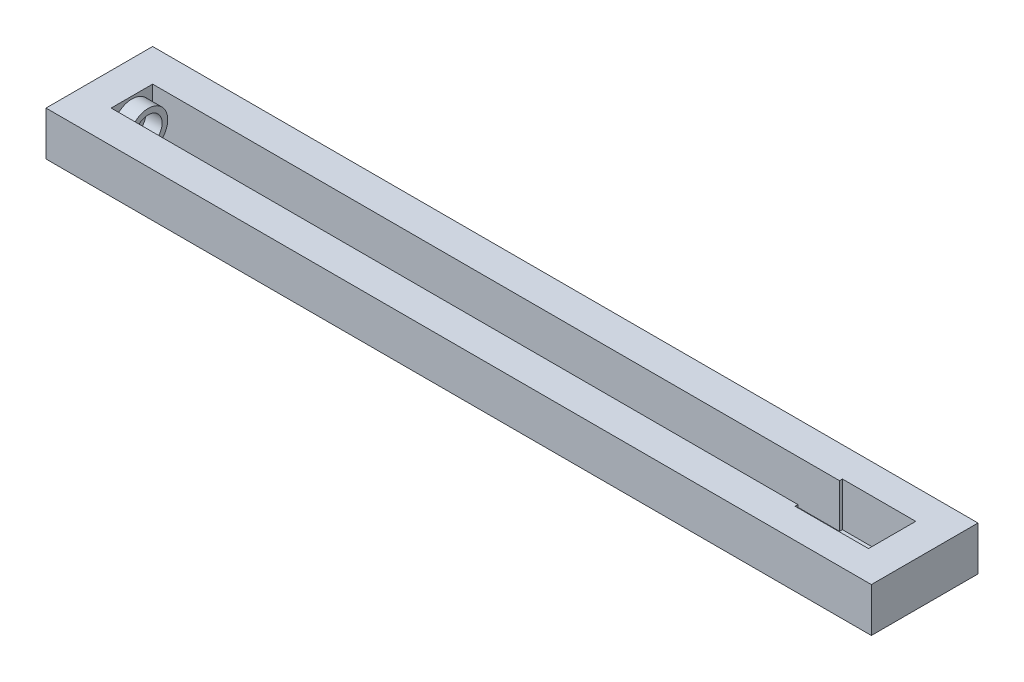
ISO-10303-21;
HEADER;
FILE_DESCRIPTION(('STEP AP214'),'2;1');
FILE_NAME('part.step','',(''),(''),'','','');
FILE_SCHEMA(('AUTOMOTIVE_DESIGN { 1 0 10303 214 1 1 1 1 }'));
ENDSEC;
DATA;
#1=APPLICATION_CONTEXT('core data for automotive mechanical design processes');
#2=APPLICATION_PROTOCOL_DEFINITION('international standard','automotive_design',2000,#1);
#3=PRODUCT_CONTEXT('',#1,'mechanical');
#4=PRODUCT('Part','Part','',(#3));
#5=PRODUCT_RELATED_PRODUCT_CATEGORY('part','',(#4));
#6=PRODUCT_DEFINITION_FORMATION('','',#4);
#7=PRODUCT_DEFINITION_CONTEXT('part definition',#1,'design');
#8=PRODUCT_DEFINITION('design','',#6,#7);
#9=PRODUCT_DEFINITION_SHAPE('','',#8);
#10=(LENGTH_UNIT() NAMED_UNIT(*) SI_UNIT(.MILLI.,.METRE.));
#11=(NAMED_UNIT(*) PLANE_ANGLE_UNIT() SI_UNIT($,.RADIAN.));
#12=(NAMED_UNIT(*) SI_UNIT($,.STERADIAN.) SOLID_ANGLE_UNIT());
#13=UNCERTAINTY_MEASURE_WITH_UNIT(LENGTH_MEASURE(1.E-05),#10,'distance_accuracy_value','');
#14=(GEOMETRIC_REPRESENTATION_CONTEXT(3) GLOBAL_UNCERTAINTY_ASSIGNED_CONTEXT((#13)) GLOBAL_UNIT_ASSIGNED_CONTEXT((#10,
#11,#12)) REPRESENTATION_CONTEXT('',''));
#15=CARTESIAN_POINT('',(0.,0.,0.));
#16=DIRECTION('',(0.,0.,1.));
#17=DIRECTION('',(1.,0.,0.));
#18=AXIS2_PLACEMENT_3D('',#15,#16,#17);
#19=CARTESIAN_POINT('',(0.,0.,0.));
#20=DIRECTION('',(0.,1.,0.));
#21=DIRECTION('',(0.,0.,1.));
#22=AXIS2_PLACEMENT_3D('',#19,#20,#21);
#23=PLANE('',#22);
#24=DIRECTION('',(0.,0.,1.));
#25=VECTOR('',#24,1.);
#26=CARTESIAN_POINT('',(-380.,0.,-49.1));
#27=LINE('',#26,#25);
#28=CARTESIAN_POINT('',(-380.,0.,-49.1));
#29=VERTEX_POINT('',#28);
#30=CARTESIAN_POINT('',(-380.,0.,49.1));
#31=VERTEX_POINT('',#30);
#32=EDGE_CURVE('E246',#29,#31,#27,.T.);
#33=ORIENTED_EDGE('',*,*,#32,.F.);
#34=DIRECTION('',(-1.,0.,0.));
#35=VECTOR('',#34,1.);
#36=CARTESIAN_POINT('',(-380.,0.,-49.1));
#37=LINE('',#36,#35);
#38=CARTESIAN_POINT('',(380.,0.,-49.1));
#39=VERTEX_POINT('',#38);
#40=EDGE_CURVE('E251',#39,#29,#37,.T.);
#41=ORIENTED_EDGE('',*,*,#40,.F.);
#42=DIRECTION('',(0.,0.,-1.));
#43=VECTOR('',#42,1.);
#44=CARTESIAN_POINT('',(380.,0.,-49.1));
#45=LINE('',#44,#43);
#46=CARTESIAN_POINT('',(380.,0.,49.1));
#47=VERTEX_POINT('',#46);
#48=EDGE_CURVE('E262',#47,#39,#45,.T.);
#49=ORIENTED_EDGE('',*,*,#48,.F.);
#50=DIRECTION('',(1.,0.,0.));
#51=VECTOR('',#50,1.);
#52=CARTESIAN_POINT('',(-380.,0.,49.1));
#53=LINE('',#52,#51);
#54=EDGE_CURVE('E260',#31,#47,#53,.T.);
#55=ORIENTED_EDGE('',*,*,#54,.F.);
#56=EDGE_LOOP('',(#33,#41,#49,#55));
#57=FACE_BOUND('',#56,.T.);
#58=DIRECTION('',(0.,0.,1.));
#59=VECTOR('',#58,1.);
#60=CARTESIAN_POINT('',(19.05,0.,-22.185));
#61=LINE('',#60,#59);
#62=CARTESIAN_POINT('',(19.05,0.,-22.185));
#63=VERTEX_POINT('',#62);
#64=CARTESIAN_POINT('',(19.05,0.,22.185));
#65=VERTEX_POINT('',#64);
#66=EDGE_CURVE('E171',#63,#65,#61,.T.);
#67=ORIENTED_EDGE('',*,*,#66,.F.);
#68=DIRECTION('',(1.,0.,0.));
#69=VECTOR('',#68,1.);
#70=CARTESIAN_POINT('',(-19.05,0.,-22.185));
#71=LINE('',#70,#69);
#72=CARTESIAN_POINT('',(-19.05,0.,-22.185));
#73=VERTEX_POINT('',#72);
#74=EDGE_CURVE('E168',#73,#63,#71,.T.);
#75=ORIENTED_EDGE('',*,*,#74,.F.);
#76=DIRECTION('',(0.,0.,-1.));
#77=VECTOR('',#76,1.);
#78=CARTESIAN_POINT('',(-19.05,0.,-22.185));
#79=LINE('',#78,#77);
#80=CARTESIAN_POINT('',(-19.05,0.,22.185));
#81=VERTEX_POINT('',#80);
#82=EDGE_CURVE('E58',#81,#73,#79,.T.);
#83=ORIENTED_EDGE('',*,*,#82,.F.);
#84=DIRECTION('',(-1.,0.,0.));
#85=VECTOR('',#84,1.);
#86=CARTESIAN_POINT('',(-19.05,0.,22.185));
#87=LINE('',#86,#85);
#88=EDGE_CURVE('E53',#65,#81,#87,.T.);
#89=ORIENTED_EDGE('',*,*,#88,.F.);
#90=EDGE_LOOP('',(#67,#75,#83,#89));
#91=FACE_BOUND('',#90,.T.);
#92=ADVANCED_FACE('F38',(#57,#91),#23,.F.);
#93=CARTESIAN_POINT('',(350.,40.64,-19.1));
#94=DIRECTION('',(-1.,0.,0.));
#95=DIRECTION('',(0.,0.,1.));
#96=AXIS2_PLACEMENT_3D('',#93,#94,#95);
#97=PLANE('',#96);
#98=DIRECTION('',(0.,0.,-1.));
#99=VECTOR('',#98,1.);
#100=CARTESIAN_POINT('',(350.,40.64,-19.1));
#101=LINE('',#100,#99);
#102=CARTESIAN_POINT('',(350.,40.64,21.75));
#103=VERTEX_POINT('',#102);
#104=CARTESIAN_POINT('',(350.,40.64,-21.75));
#105=VERTEX_POINT('',#104);
#106=EDGE_CURVE('E230',#103,#105,#101,.T.);
#107=ORIENTED_EDGE('',*,*,#106,.T.);
#108=DIRECTION('',(0.,1.,0.));
#109=VECTOR('',#108,1.);
#110=CARTESIAN_POINT('',(350.,-80.0485528859451,-21.75));
#111=LINE('',#110,#109);
#112=CARTESIAN_POINT('',(350.,0.254000000000004,-21.75));
#113=VERTEX_POINT('',#112);
#114=EDGE_CURVE('E210',#113,#105,#111,.T.);
#115=ORIENTED_EDGE('',*,*,#114,.F.);
#116=DIRECTION('',(0.,0.,1.));
#117=VECTOR('',#116,1.);
#118=CARTESIAN_POINT('',(350.,0.254,19.1));
#119=LINE('',#118,#117);
#120=CARTESIAN_POINT('',(350.,0.254000000000004,21.75));
#121=VERTEX_POINT('',#120);
#122=EDGE_CURVE('E220',#113,#121,#119,.T.);
#123=ORIENTED_EDGE('',*,*,#122,.T.);
#124=DIRECTION('',(0.,1.,0.));
#125=VECTOR('',#124,1.);
#126=CARTESIAN_POINT('',(350.,-80.0485528859451,21.75));
#127=LINE('',#126,#125);
#128=EDGE_CURVE('E202',#121,#103,#127,.T.);
#129=ORIENTED_EDGE('',*,*,#128,.T.);
#130=EDGE_LOOP('',(#107,#115,#123,#129));
#131=FACE_BOUND('',#130,.T.);
#132=ADVANCED_FACE('F308',(#131),#97,.T.);
#133=CARTESIAN_POINT('',(-350.,40.64,-19.1));
#134=DIRECTION('',(0.,0.,1.));
#135=DIRECTION('',(1.,0.,0.));
#136=AXIS2_PLACEMENT_3D('',#133,#134,#135);
#137=PLANE('',#136);
#138=DIRECTION('',(0.,-1.,0.));
#139=VECTOR('',#138,1.);
#140=CARTESIAN_POINT('',(282.5,40.64,-19.1));
#141=LINE('',#140,#139);
#142=CARTESIAN_POINT('',(282.5,40.64,-19.1));
#143=VERTEX_POINT('',#142);
#144=CARTESIAN_POINT('',(282.5,0.254000000000004,-19.1));
#145=VERTEX_POINT('',#144);
#146=EDGE_CURVE('E218',#143,#145,#141,.T.);
#147=ORIENTED_EDGE('',*,*,#146,.F.);
#148=DIRECTION('',(-1.,0.,0.));
#149=VECTOR('',#148,1.);
#150=CARTESIAN_POINT('',(-350.,40.64,-19.1));
#151=LINE('',#150,#149);
#152=CARTESIAN_POINT('',(-350.,40.64,-19.1));
#153=VERTEX_POINT('',#152);
#154=EDGE_CURVE('E232',#143,#153,#151,.T.);
#155=ORIENTED_EDGE('',*,*,#154,.T.);
#156=DIRECTION('',(0.,-1.,0.));
#157=VECTOR('',#156,1.);
#158=CARTESIAN_POINT('',(-350.,40.64,-19.1));
#159=LINE('',#158,#157);
#160=CARTESIAN_POINT('',(-349.999999999999,0.254,-19.1));
#161=VERTEX_POINT('',#160);
#162=EDGE_CURVE('E243',#153,#161,#159,.T.);
#163=ORIENTED_EDGE('',*,*,#162,.T.);
#164=DIRECTION('',(1.,0.,0.));
#165=VECTOR('',#164,1.);
#166=CARTESIAN_POINT('',(-349.999999999999,0.254,-19.1));
#167=LINE('',#166,#165);
#168=EDGE_CURVE('E227',#161,#145,#167,.T.);
#169=ORIENTED_EDGE('',*,*,#168,.T.);
#170=EDGE_LOOP('',(#147,#155,#163,#169));
#171=FACE_BOUND('',#170,.T.);
#172=ADVANCED_FACE('F312',(#171),#137,.T.);
#173=CARTESIAN_POINT('',(-350.,40.64,-19.1));
#174=DIRECTION('',(1.,0.,0.));
#175=DIRECTION('',(0.,0.,-1.));
#176=AXIS2_PLACEMENT_3D('',#173,#174,#175);
#177=PLANE('',#176);
#178=CARTESIAN_POINT('',(-350.,20.32,0.));
#179=DIRECTION('',(1.,0.,0.));
#180=DIRECTION('',(0.,0.,-1.));
#181=AXIS2_PLACEMENT_3D('',#178,#179,#180);
#182=CIRCLE('',#181,18.);
#183=CARTESIAN_POINT('',(-350.,20.32,-18.));
#184=VERTEX_POINT('',#183);
#185=EDGE_CURVE('E175',#184,#184,#182,.T.);
#186=ORIENTED_EDGE('',*,*,#185,.F.);
#187=EDGE_LOOP('',(#186));
#188=FACE_BOUND('',#187,.T.);
#189=DIRECTION('',(0.,-1.,0.));
#190=VECTOR('',#189,1.);
#191=CARTESIAN_POINT('',(-350.,40.64,19.1));
#192=LINE('',#191,#190);
#193=CARTESIAN_POINT('',(-350.,40.64,19.1));
#194=VERTEX_POINT('',#193);
#195=CARTESIAN_POINT('',(-350.,0.253999999999997,19.1));
#196=VERTEX_POINT('',#195);
#197=EDGE_CURVE('E240',#194,#196,#192,.T.);
#198=ORIENTED_EDGE('',*,*,#197,.T.);
#199=DIRECTION('',(0.,0.,-1.));
#200=VECTOR('',#199,1.);
#201=CARTESIAN_POINT('',(-349.999999999999,0.254,19.1));
#202=LINE('',#201,#200);
#203=EDGE_CURVE('E224',#196,#161,#202,.T.);
#204=ORIENTED_EDGE('',*,*,#203,.T.);
#205=ORIENTED_EDGE('',*,*,#162,.F.);
#206=DIRECTION('',(0.,0.,1.));
#207=VECTOR('',#206,1.);
#208=CARTESIAN_POINT('',(-350.,40.64,-19.1));
#209=LINE('',#208,#207);
#210=EDGE_CURVE('E234',#153,#194,#209,.T.);
#211=ORIENTED_EDGE('',*,*,#210,.T.);
#212=EDGE_LOOP('',(#198,#204,#205,#211));
#213=FACE_BOUND('',#212,.T.);
#214=ADVANCED_FACE('F301',(#188,#213),#177,.T.);
#215=CARTESIAN_POINT('',(-350.,40.64,19.1));
#216=DIRECTION('',(0.,0.,-1.));
#217=DIRECTION('',(-1.,0.,0.));
#218=AXIS2_PLACEMENT_3D('',#215,#216,#217);
#219=PLANE('',#218);
#220=DIRECTION('',(0.,1.,0.));
#221=VECTOR('',#220,1.);
#222=CARTESIAN_POINT('',(282.5,40.64,19.1));
#223=LINE('',#222,#221);
#224=CARTESIAN_POINT('',(282.5,0.254000000000004,19.1));
#225=VERTEX_POINT('',#224);
#226=CARTESIAN_POINT('',(282.5,40.64,19.1));
#227=VERTEX_POINT('',#226);
#228=EDGE_CURVE('E216',#225,#227,#223,.T.);
#229=ORIENTED_EDGE('',*,*,#228,.F.);
#230=DIRECTION('',(-1.,0.,0.));
#231=VECTOR('',#230,1.);
#232=CARTESIAN_POINT('',(-349.999999999999,0.254,19.1));
#233=LINE('',#232,#231);
#234=EDGE_CURVE('E222',#225,#196,#233,.T.);
#235=ORIENTED_EDGE('',*,*,#234,.T.);
#236=ORIENTED_EDGE('',*,*,#197,.F.);
#237=DIRECTION('',(1.,0.,0.));
#238=VECTOR('',#237,1.);
#239=CARTESIAN_POINT('',(-350.,40.64,19.1));
#240=LINE('',#239,#238);
#241=EDGE_CURVE('E237',#194,#227,#240,.T.);
#242=ORIENTED_EDGE('',*,*,#241,.T.);
#243=EDGE_LOOP('',(#229,#235,#236,#242));
#244=FACE_BOUND('',#243,.T.);
#245=ADVANCED_FACE('F294',(#244),#219,.T.);
#246=CARTESIAN_POINT('',(0.,40.64,0.));
#247=DIRECTION('',(0.,1.,0.));
#248=DIRECTION('',(0.,0.,1.));
#249=AXIS2_PLACEMENT_3D('',#246,#247,#248);
#250=PLANE('',#249);
#251=DIRECTION('',(0.,0.,1.));
#252=VECTOR('',#251,1.);
#253=CARTESIAN_POINT('',(282.5,40.64,-21.75));
#254=LINE('',#253,#252);
#255=CARTESIAN_POINT('',(282.5,40.64,21.75));
#256=VERTEX_POINT('',#255);
#257=EDGE_CURVE('E193',#227,#256,#254,.T.);
#258=ORIENTED_EDGE('',*,*,#257,.F.);
#259=ORIENTED_EDGE('',*,*,#241,.F.);
#260=ORIENTED_EDGE('',*,*,#210,.F.);
#261=ORIENTED_EDGE('',*,*,#154,.F.);
#262=CARTESIAN_POINT('',(282.5,40.64,-21.75));
#263=VERTEX_POINT('',#262);
#264=EDGE_CURVE('E191',#263,#143,#254,.T.);
#265=ORIENTED_EDGE('',*,*,#264,.F.);
#266=DIRECTION('',(-1.,0.,0.));
#267=VECTOR('',#266,1.);
#268=CARTESIAN_POINT('',(350.,40.64,-21.75));
#269=LINE('',#268,#267);
#270=EDGE_CURVE('E184',#105,#263,#269,.T.);
#271=ORIENTED_EDGE('',*,*,#270,.F.);
#272=ORIENTED_EDGE('',*,*,#106,.F.);
#273=DIRECTION('',(1.,0.,0.));
#274=VECTOR('',#273,1.);
#275=CARTESIAN_POINT('',(350.,40.64,21.75));
#276=LINE('',#275,#274);
#277=EDGE_CURVE('E187',#256,#103,#276,.T.);
#278=ORIENTED_EDGE('',*,*,#277,.F.);
#279=EDGE_LOOP('',(#258,#259,#260,#261,#265,#271,#272,#278));
#280=FACE_BOUND('',#279,.T.);
#281=DIRECTION('',(0.,0.,1.));
#282=VECTOR('',#281,1.);
#283=CARTESIAN_POINT('',(-380.,40.64,-49.1));
#284=LINE('',#283,#282);
#285=CARTESIAN_POINT('',(-380.,40.64,-49.1));
#286=VERTEX_POINT('',#285);
#287=CARTESIAN_POINT('',(-380.,40.64,49.1));
#288=VERTEX_POINT('',#287);
#289=EDGE_CURVE('E247',#286,#288,#284,.T.);
#290=ORIENTED_EDGE('',*,*,#289,.T.);
#291=DIRECTION('',(1.,0.,0.));
#292=VECTOR('',#291,1.);
#293=CARTESIAN_POINT('',(-380.,40.64,49.1));
#294=LINE('',#293,#292);
#295=CARTESIAN_POINT('',(380.,40.64,49.1));
#296=VERTEX_POINT('',#295);
#297=EDGE_CURVE('E250',#288,#296,#294,.T.);
#298=ORIENTED_EDGE('',*,*,#297,.T.);
#299=DIRECTION('',(0.,0.,-1.));
#300=VECTOR('',#299,1.);
#301=CARTESIAN_POINT('',(380.,40.64,-49.1));
#302=LINE('',#301,#300);
#303=CARTESIAN_POINT('',(380.,40.64,-49.1));
#304=VERTEX_POINT('',#303);
#305=EDGE_CURVE('E253',#296,#304,#302,.T.);
#306=ORIENTED_EDGE('',*,*,#305,.T.);
#307=DIRECTION('',(-1.,0.,0.));
#308=VECTOR('',#307,1.);
#309=CARTESIAN_POINT('',(-380.,40.64,-49.1));
#310=LINE('',#309,#308);
#311=EDGE_CURVE('E255',#304,#286,#310,.T.);
#312=ORIENTED_EDGE('',*,*,#311,.T.);
#313=EDGE_LOOP('',(#290,#298,#306,#312));
#314=FACE_BOUND('',#313,.T.);
#315=ADVANCED_FACE('F292',(#280,#314),#250,.T.);
#316=CARTESIAN_POINT('',(-380.,40.64,-49.1));
#317=DIRECTION('',(1.,0.,0.));
#318=DIRECTION('',(0.,0.,-1.));
#319=AXIS2_PLACEMENT_3D('',#316,#317,#318);
#320=PLANE('',#319);
#321=ORIENTED_EDGE('',*,*,#32,.T.);
#322=DIRECTION('',(0.,-1.,0.));
#323=VECTOR('',#322,1.);
#324=CARTESIAN_POINT('',(-380.,40.64,49.1));
#325=LINE('',#324,#323);
#326=EDGE_CURVE('E46',#288,#31,#325,.T.);
#327=ORIENTED_EDGE('',*,*,#326,.F.);
#328=ORIENTED_EDGE('',*,*,#289,.F.);
#329=DIRECTION('',(0.,-1.,0.));
#330=VECTOR('',#329,1.);
#331=CARTESIAN_POINT('',(-380.,40.64,-49.1));
#332=LINE('',#331,#330);
#333=EDGE_CURVE('E257',#286,#29,#332,.T.);
#334=ORIENTED_EDGE('',*,*,#333,.T.);
#335=EDGE_LOOP('',(#321,#327,#328,#334));
#336=FACE_BOUND('',#335,.T.);
#337=ADVANCED_FACE('F40',(#336),#320,.F.);
#338=CARTESIAN_POINT('',(-380.,40.64,49.1));
#339=DIRECTION('',(0.,0.,-1.));
#340=DIRECTION('',(-1.,0.,0.));
#341=AXIS2_PLACEMENT_3D('',#338,#339,#340);
#342=PLANE('',#341);
#343=ORIENTED_EDGE('',*,*,#54,.T.);
#344=DIRECTION('',(0.,-1.,0.));
#345=VECTOR('',#344,1.);
#346=CARTESIAN_POINT('',(380.,40.64,49.1));
#347=LINE('',#346,#345);
#348=EDGE_CURVE('E270',#296,#47,#347,.T.);
#349=ORIENTED_EDGE('',*,*,#348,.F.);
#350=ORIENTED_EDGE('',*,*,#297,.F.);
#351=ORIENTED_EDGE('',*,*,#326,.T.);
#352=EDGE_LOOP('',(#343,#349,#350,#351));
#353=FACE_BOUND('',#352,.T.);
#354=ADVANCED_FACE('F275',(#353),#342,.F.);
#355=CARTESIAN_POINT('',(380.,40.64,-49.1));
#356=DIRECTION('',(-1.,0.,0.));
#357=DIRECTION('',(0.,0.,1.));
#358=AXIS2_PLACEMENT_3D('',#355,#356,#357);
#359=PLANE('',#358);
#360=ORIENTED_EDGE('',*,*,#48,.T.);
#361=DIRECTION('',(0.,-1.,0.));
#362=VECTOR('',#361,1.);
#363=CARTESIAN_POINT('',(380.,40.64,-49.1));
#364=LINE('',#363,#362);
#365=EDGE_CURVE('E267',#304,#39,#364,.T.);
#366=ORIENTED_EDGE('',*,*,#365,.F.);
#367=ORIENTED_EDGE('',*,*,#305,.F.);
#368=ORIENTED_EDGE('',*,*,#348,.T.);
#369=EDGE_LOOP('',(#360,#366,#367,#368));
#370=FACE_BOUND('',#369,.T.);
#371=ADVANCED_FACE('F286',(#370),#359,.F.);
#372=CARTESIAN_POINT('',(-380.,40.64,-49.1));
#373=DIRECTION('',(0.,0.,1.));
#374=DIRECTION('',(1.,0.,0.));
#375=AXIS2_PLACEMENT_3D('',#372,#373,#374);
#376=PLANE('',#375);
#377=ORIENTED_EDGE('',*,*,#40,.T.);
#378=ORIENTED_EDGE('',*,*,#333,.F.);
#379=ORIENTED_EDGE('',*,*,#311,.F.);
#380=ORIENTED_EDGE('',*,*,#365,.T.);
#381=EDGE_LOOP('',(#377,#378,#379,#380));
#382=FACE_BOUND('',#381,.T.);
#383=ADVANCED_FACE('F290',(#382),#376,.F.);
#384=CARTESIAN_POINT('',(0.,0.254,0.));
#385=DIRECTION('',(0.,-1.,0.));
#386=DIRECTION('',(0.,0.,-1.));
#387=AXIS2_PLACEMENT_3D('',#384,#385,#386);
#388=PLANE('',#387);
#389=ORIENTED_EDGE('',*,*,#234,.F.);
#390=DIRECTION('',(0.,0.,1.));
#391=VECTOR('',#390,1.);
#392=CARTESIAN_POINT('',(282.5,0.254000000000004,-21.75));
#393=LINE('',#392,#391);
#394=CARTESIAN_POINT('',(282.5,0.254000000000004,21.75));
#395=VERTEX_POINT('',#394);
#396=EDGE_CURVE('E207',#225,#395,#393,.T.);
#397=ORIENTED_EDGE('',*,*,#396,.T.);
#398=DIRECTION('',(1.,0.,0.));
#399=VECTOR('',#398,1.);
#400=CARTESIAN_POINT('',(350.,0.254000000000004,21.75));
#401=LINE('',#400,#399);
#402=EDGE_CURVE('E199',#395,#121,#401,.T.);
#403=ORIENTED_EDGE('',*,*,#402,.T.);
#404=ORIENTED_EDGE('',*,*,#122,.F.);
#405=DIRECTION('',(-1.,0.,0.));
#406=VECTOR('',#405,1.);
#407=CARTESIAN_POINT('',(350.,0.254000000000004,-21.75));
#408=LINE('',#407,#406);
#409=CARTESIAN_POINT('',(282.5,0.254000000000004,-21.75));
#410=VERTEX_POINT('',#409);
#411=EDGE_CURVE('E190',#113,#410,#408,.T.);
#412=ORIENTED_EDGE('',*,*,#411,.T.);
#413=EDGE_CURVE('E204',#410,#145,#393,.T.);
#414=ORIENTED_EDGE('',*,*,#413,.T.);
#415=ORIENTED_EDGE('',*,*,#168,.F.);
#416=ORIENTED_EDGE('',*,*,#203,.F.);
#417=EDGE_LOOP('',(#389,#397,#403,#404,#412,#414,#415,#416));
#418=FACE_BOUND('',#417,.T.);
#419=ADVANCED_FACE('F317',(#418),#388,.F.);
#420=CARTESIAN_POINT('',(282.5,-80.0485528859451,-21.75));
#421=DIRECTION('',(-1.,0.,0.));
#422=DIRECTION('',(0.,0.,1.));
#423=AXIS2_PLACEMENT_3D('',#420,#421,#422);
#424=PLANE('',#423);
#425=ORIENTED_EDGE('',*,*,#146,.T.);
#426=ORIENTED_EDGE('',*,*,#413,.F.);
#427=DIRECTION('',(0.,1.,0.));
#428=VECTOR('',#427,1.);
#429=CARTESIAN_POINT('',(282.5,-80.0485528859451,-21.75));
#430=LINE('',#429,#428);
#431=EDGE_CURVE('E198',#410,#263,#430,.T.);
#432=ORIENTED_EDGE('',*,*,#431,.T.);
#433=ORIENTED_EDGE('',*,*,#264,.T.);
#434=EDGE_LOOP('',(#425,#426,#432,#433));
#435=FACE_BOUND('',#434,.T.);
#436=ADVANCED_FACE('F339',(#435),#424,.F.);
#437=CARTESIAN_POINT('',(350.,-80.0485528859451,-21.75));
#438=DIRECTION('',(0.,0.,-1.));
#439=DIRECTION('',(-1.,0.,0.));
#440=AXIS2_PLACEMENT_3D('',#437,#438,#439);
#441=PLANE('',#440);
#442=ORIENTED_EDGE('',*,*,#114,.T.);
#443=ORIENTED_EDGE('',*,*,#270,.T.);
#444=ORIENTED_EDGE('',*,*,#431,.F.);
#445=ORIENTED_EDGE('',*,*,#411,.F.);
#446=EDGE_LOOP('',(#442,#443,#444,#445));
#447=FACE_BOUND('',#446,.T.);
#448=ADVANCED_FACE('F347',(#447),#441,.F.);
#449=ORIENTED_EDGE('',*,*,#228,.T.);
#450=ORIENTED_EDGE('',*,*,#257,.T.);
#451=DIRECTION('',(0.,1.,0.));
#452=VECTOR('',#451,1.);
#453=CARTESIAN_POINT('',(282.5,-80.0485528859451,21.75));
#454=LINE('',#453,#452);
#455=EDGE_CURVE('E203',#395,#256,#454,.T.);
#456=ORIENTED_EDGE('',*,*,#455,.F.);
#457=ORIENTED_EDGE('',*,*,#396,.F.);
#458=EDGE_LOOP('',(#449,#450,#456,#457));
#459=FACE_BOUND('',#458,.T.);
#460=ADVANCED_FACE('F350',(#459),#424,.F.);
#461=CARTESIAN_POINT('',(350.,-80.0485528859451,21.75));
#462=DIRECTION('',(0.,0.,1.));
#463=DIRECTION('',(1.,0.,0.));
#464=AXIS2_PLACEMENT_3D('',#461,#462,#463);
#465=PLANE('',#464);
#466=ORIENTED_EDGE('',*,*,#455,.T.);
#467=ORIENTED_EDGE('',*,*,#277,.T.);
#468=ORIENTED_EDGE('',*,*,#128,.F.);
#469=ORIENTED_EDGE('',*,*,#402,.F.);
#470=EDGE_LOOP('',(#466,#467,#468,#469));
#471=FACE_BOUND('',#470,.T.);
#472=ADVANCED_FACE('F363',(#471),#465,.F.);
#473=CARTESIAN_POINT('',(-335.,20.32,0.));
#474=DIRECTION('',(1.,0.,0.));
#475=DIRECTION('',(0.,0.,-1.));
#476=AXIS2_PLACEMENT_3D('',#473,#474,#475);
#477=PLANE('',#476);
#478=CARTESIAN_POINT('',(-335.,20.32,0.));
#479=DIRECTION('',(1.,0.,0.));
#480=DIRECTION('',(0.,0.,-1.));
#481=AXIS2_PLACEMENT_3D('',#478,#479,#480);
#482=CIRCLE('',#481,18.);
#483=CARTESIAN_POINT('',(-335.,20.32,-18.));
#484=VERTEX_POINT('',#483);
#485=EDGE_CURVE('E181',#484,#484,#482,.T.);
#486=ORIENTED_EDGE('',*,*,#485,.T.);
#487=EDGE_LOOP('',(#486));
#488=FACE_BOUND('',#487,.T.);
#489=CARTESIAN_POINT('',(-335.,20.32,0.));
#490=DIRECTION('',(1.,0.,0.));
#491=DIRECTION('',(0.,0.,-1.));
#492=AXIS2_PLACEMENT_3D('',#489,#490,#491);
#493=CIRCLE('',#492,12.8397);
#494=CARTESIAN_POINT('',(-335.,20.32,-12.8397));
#495=VERTEX_POINT('',#494);
#496=EDGE_CURVE('E172',#495,#495,#493,.T.);
#497=ORIENTED_EDGE('',*,*,#496,.F.);
#498=EDGE_LOOP('',(#497));
#499=FACE_BOUND('',#498,.T.);
#500=ADVANCED_FACE('F370',(#488,#499),#477,.T.);
#501=CARTESIAN_POINT('',(-335.,20.32,0.));
#502=DIRECTION('',(-1.,0.,0.));
#503=DIRECTION('',(0.,0.,1.));
#504=AXIS2_PLACEMENT_3D('',#501,#502,#503);
#505=CYLINDRICAL_SURFACE('',#504,18.);
#506=ORIENTED_EDGE('',*,*,#485,.F.);
#507=EDGE_LOOP('',(#506));
#508=FACE_BOUND('',#507,.T.);
#509=ORIENTED_EDGE('',*,*,#185,.T.);
#510=EDGE_LOOP('',(#509));
#511=FACE_BOUND('',#510,.T.);
#512=ADVANCED_FACE('F379',(#508,#511),#505,.T.);
#513=CARTESIAN_POINT('',(-335.,20.32,0.));
#514=DIRECTION('',(-1.,0.,0.));
#515=DIRECTION('',(0.,0.,1.));
#516=AXIS2_PLACEMENT_3D('',#513,#514,#515);
#517=CYLINDRICAL_SURFACE('',#516,12.8397);
#518=ORIENTED_EDGE('',*,*,#496,.T.);
#519=EDGE_LOOP('',(#518));
#520=FACE_BOUND('',#519,.T.);
#521=CARTESIAN_POINT('',(-350.,20.32,0.));
#522=DIRECTION('',(1.,0.,0.));
#523=DIRECTION('',(0.,0.,-1.));
#524=AXIS2_PLACEMENT_3D('',#521,#522,#523);
#525=CIRCLE('',#524,12.8397);
#526=CARTESIAN_POINT('',(-350.,20.32,-12.8397));
#527=VERTEX_POINT('',#526);
#528=EDGE_CURVE('E11',#527,#527,#525,.F.);
#529=ORIENTED_EDGE('',*,*,#528,.T.);
#530=EDGE_LOOP('',(#529));
#531=FACE_BOUND('',#530,.T.);
#532=ADVANCED_FACE('F387',(#520,#531),#517,.F.);
#533=ORIENTED_EDGE('',*,*,#528,.F.);
#534=EDGE_LOOP('',(#533));
#535=FACE_BOUND('',#534,.T.);
#536=ADVANCED_FACE('F395',(#535),#177,.T.);
#537=CARTESIAN_POINT('',(19.05,-20.,-22.185));
#538=DIRECTION('',(-1.,0.,0.));
#539=DIRECTION('',(0.,0.,1.));
#540=AXIS2_PLACEMENT_3D('',#537,#538,#539);
#541=PLANE('',#540);
#542=ORIENTED_EDGE('',*,*,#66,.T.);
#543=DIRECTION('',(0.,1.,0.));
#544=VECTOR('',#543,1.);
#545=CARTESIAN_POINT('',(19.05,-20.,22.185));
#546=LINE('',#545,#544);
#547=CARTESIAN_POINT('',(19.05,-20.,22.185));
#548=VERTEX_POINT('',#547);
#549=EDGE_CURVE('E152',#548,#65,#546,.T.);
#550=ORIENTED_EDGE('',*,*,#549,.F.);
#551=DIRECTION('',(0.,0.,1.));
#552=VECTOR('',#551,1.);
#553=CARTESIAN_POINT('',(19.05,-20.,-22.185));
#554=LINE('',#553,#552);
#555=CARTESIAN_POINT('',(19.05,-20.,-22.185));
#556=VERTEX_POINT('',#555);
#557=EDGE_CURVE('E159',#556,#548,#554,.T.);
#558=ORIENTED_EDGE('',*,*,#557,.F.);
#559=DIRECTION('',(0.,1.,0.));
#560=VECTOR('',#559,1.);
#561=CARTESIAN_POINT('',(19.05,-20.,-22.185));
#562=LINE('',#561,#560);
#563=EDGE_CURVE('E544',#556,#63,#562,.T.);
#564=ORIENTED_EDGE('',*,*,#563,.T.);
#565=EDGE_LOOP('',(#542,#550,#558,#564));
#566=FACE_BOUND('',#565,.T.);
#567=ADVANCED_FACE('F170',(#566),#541,.F.);
#568=CARTESIAN_POINT('',(-19.05,-20.,22.185));
#569=DIRECTION('',(0.,0.,-1.));
#570=DIRECTION('',(-1.,0.,0.));
#571=AXIS2_PLACEMENT_3D('',#568,#569,#570);
#572=PLANE('',#571);
#573=ORIENTED_EDGE('',*,*,#88,.T.);
#574=DIRECTION('',(0.,1.,0.));
#575=VECTOR('',#574,1.);
#576=CARTESIAN_POINT('',(-19.05,-20.,22.185));
#577=LINE('',#576,#575);
#578=CARTESIAN_POINT('',(-19.05,-20.,22.185));
#579=VERTEX_POINT('',#578);
#580=EDGE_CURVE('E155',#579,#81,#577,.T.);
#581=ORIENTED_EDGE('',*,*,#580,.F.);
#582=DIRECTION('',(-1.,0.,0.));
#583=VECTOR('',#582,1.);
#584=CARTESIAN_POINT('',(-19.05,-20.,22.185));
#585=LINE('',#584,#583);
#586=EDGE_CURVE('E148',#548,#579,#585,.T.);
#587=ORIENTED_EDGE('',*,*,#586,.F.);
#588=ORIENTED_EDGE('',*,*,#549,.T.);
#589=EDGE_LOOP('',(#573,#581,#587,#588));
#590=FACE_BOUND('',#589,.T.);
#591=ADVANCED_FACE('F150',(#590),#572,.F.);
#592=CARTESIAN_POINT('',(-19.05,-20.,-22.185));
#593=DIRECTION('',(1.,0.,0.));
#594=DIRECTION('',(0.,0.,-1.));
#595=AXIS2_PLACEMENT_3D('',#592,#593,#594);
#596=PLANE('',#595);
#597=ORIENTED_EDGE('',*,*,#82,.T.);
#598=DIRECTION('',(0.,1.,0.));
#599=VECTOR('',#598,1.);
#600=CARTESIAN_POINT('',(-19.05,-20.,-22.185));
#601=LINE('',#600,#599);
#602=CARTESIAN_POINT('',(-19.05,-20.,-22.185));
#603=VERTEX_POINT('',#602);
#604=EDGE_CURVE('E177',#603,#73,#601,.T.);
#605=ORIENTED_EDGE('',*,*,#604,.F.);
#606=DIRECTION('',(0.,0.,-1.));
#607=VECTOR('',#606,1.);
#608=CARTESIAN_POINT('',(-19.05,-20.,-22.185));
#609=LINE('',#608,#607);
#610=EDGE_CURVE('E158',#579,#603,#609,.T.);
#611=ORIENTED_EDGE('',*,*,#610,.F.);
#612=ORIENTED_EDGE('',*,*,#580,.T.);
#613=EDGE_LOOP('',(#597,#605,#611,#612));
#614=FACE_BOUND('',#613,.T.);
#615=ADVANCED_FACE('F416',(#614),#596,.F.);
#616=CARTESIAN_POINT('',(-19.05,-20.,-22.185));
#617=DIRECTION('',(0.,0.,1.));
#618=DIRECTION('',(1.,0.,0.));
#619=AXIS2_PLACEMENT_3D('',#616,#617,#618);
#620=PLANE('',#619);
#621=ORIENTED_EDGE('',*,*,#74,.T.);
#622=ORIENTED_EDGE('',*,*,#563,.F.);
#623=DIRECTION('',(1.,0.,0.));
#624=VECTOR('',#623,1.);
#625=CARTESIAN_POINT('',(-19.05,-20.,-22.185));
#626=LINE('',#625,#624);
#627=EDGE_CURVE('E164',#603,#556,#626,.T.);
#628=ORIENTED_EDGE('',*,*,#627,.F.);
#629=ORIENTED_EDGE('',*,*,#604,.T.);
#630=EDGE_LOOP('',(#621,#622,#628,#629));
#631=FACE_BOUND('',#630,.T.);
#632=ADVANCED_FACE('F423',(#631),#620,.F.);
#633=CARTESIAN_POINT('',(0.,-20.,0.));
#634=DIRECTION('',(0.,1.,0.));
#635=DIRECTION('',(0.,0.,1.));
#636=AXIS2_PLACEMENT_3D('',#633,#634,#635);
#637=PLANE('',#636);
#638=ORIENTED_EDGE('',*,*,#557,.T.);
#639=ORIENTED_EDGE('',*,*,#586,.T.);
#640=ORIENTED_EDGE('',*,*,#610,.T.);
#641=ORIENTED_EDGE('',*,*,#627,.T.);
#642=EDGE_LOOP('',(#638,#639,#640,#641));
#643=FACE_BOUND('',#642,.T.);
#644=ADVANCED_FACE('F162',(#643),#637,.F.);
#645=CLOSED_SHELL('',(#92,#132,#172,#214,#245,#315,#337,#354,#371,#383,#419,#436,#448,#460,#472,
#500,#512,#532,#536,#567,#591,#615,#632,#644));
#646=MANIFOLD_SOLID_BREP('B2',#645);
#647=ADVANCED_BREP_SHAPE_REPRESENTATION('',(#18,#646),#14);
#648=SHAPE_DEFINITION_REPRESENTATION(#9,#647);
ENDSEC;
END-ISO-10303-21;
